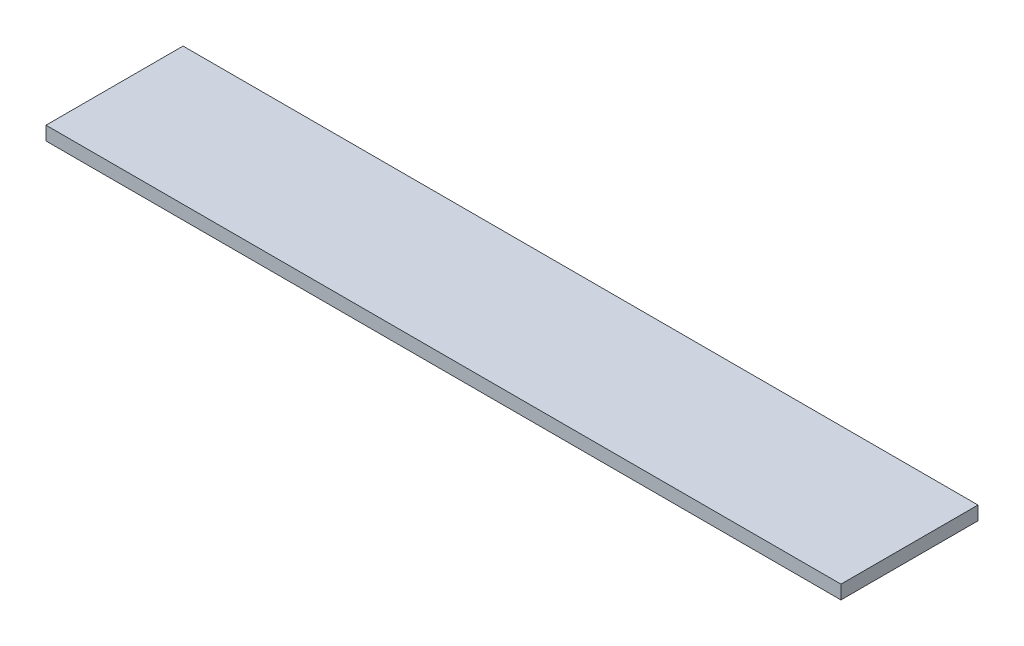
ISO-10303-21;
HEADER;
FILE_DESCRIPTION(('STEP AP214'),'2;1');
FILE_NAME('part.step','',(''),(''),'','','');
FILE_SCHEMA(('AUTOMOTIVE_DESIGN { 1 0 10303 214 1 1 1 1 }'));
ENDSEC;
DATA;
#1=APPLICATION_CONTEXT('core data for automotive mechanical design processes');
#2=APPLICATION_PROTOCOL_DEFINITION('international standard','automotive_design',2000,#1);
#3=PRODUCT_CONTEXT('',#1,'mechanical');
#4=PRODUCT('Part','Part','',(#3));
#5=PRODUCT_RELATED_PRODUCT_CATEGORY('part','',(#4));
#6=PRODUCT_DEFINITION_FORMATION('','',#4);
#7=PRODUCT_DEFINITION_CONTEXT('part definition',#1,'design');
#8=PRODUCT_DEFINITION('design','',#6,#7);
#9=PRODUCT_DEFINITION_SHAPE('','',#8);
#10=(LENGTH_UNIT() NAMED_UNIT(*) SI_UNIT(.MILLI.,.METRE.));
#11=(NAMED_UNIT(*) PLANE_ANGLE_UNIT() SI_UNIT($,.RADIAN.));
#12=(NAMED_UNIT(*) SI_UNIT($,.STERADIAN.) SOLID_ANGLE_UNIT());
#13=UNCERTAINTY_MEASURE_WITH_UNIT(LENGTH_MEASURE(1.E-05),#10,'distance_accuracy_value','');
#14=(GEOMETRIC_REPRESENTATION_CONTEXT(3) GLOBAL_UNCERTAINTY_ASSIGNED_CONTEXT((#13)) GLOBAL_UNIT_ASSIGNED_CONTEXT((#10,
#11,#12)) REPRESENTATION_CONTEXT('',''));
#15=CARTESIAN_POINT('',(0.,0.,0.));
#16=DIRECTION('',(0.,0.,1.));
#17=DIRECTION('',(1.,0.,0.));
#18=AXIS2_PLACEMENT_3D('',#15,#16,#17);
#19=CARTESIAN_POINT('',(-47.625,1.58750000000002,7.93750000000001));
#20=DIRECTION('',(0.,0.,-1.));
#21=DIRECTION('',(-1.,0.,0.));
#22=AXIS2_PLACEMENT_3D('',#19,#20,#21);
#23=PLANE('',#22);
#24=DIRECTION('',(0.,1.,0.));
#25=VECTOR('',#24,1.);
#26=CARTESIAN_POINT('',(46.0375,-0.001000000000001,7.93750000000001));
#27=LINE('',#26,#25);
#28=CARTESIAN_POINT('',(46.0375,0.,7.93750000000001));
#29=VERTEX_POINT('',#28);
#30=CARTESIAN_POINT('',(46.0375,1.58750000000002,7.93750000000001));
#31=VERTEX_POINT('',#30);
#32=EDGE_CURVE('E54',#29,#31,#27,.T.);
#33=ORIENTED_EDGE('',*,*,#32,.T.);
#34=DIRECTION('',(1.,0.,0.));
#35=VECTOR('',#34,1.);
#36=CARTESIAN_POINT('',(-47.625,1.58750000000002,7.93750000000001));
#37=LINE('',#36,#35);
#38=CARTESIAN_POINT('',(-46.0375,1.58750000000002,7.93750000000001));
#39=VERTEX_POINT('',#38);
#40=EDGE_CURVE('E46',#39,#31,#37,.T.);
#41=ORIENTED_EDGE('',*,*,#40,.F.);
#42=DIRECTION('',(0.,1.,0.));
#43=VECTOR('',#42,1.);
#44=CARTESIAN_POINT('',(-46.0375,-0.001000000000001,7.93750000000001));
#45=LINE('',#44,#43);
#46=CARTESIAN_POINT('',(-46.0375,0.,7.93750000000001));
#47=VERTEX_POINT('',#46);
#48=EDGE_CURVE('E87',#47,#39,#45,.T.);
#49=ORIENTED_EDGE('',*,*,#48,.F.);
#50=DIRECTION('',(1.,0.,0.));
#51=VECTOR('',#50,1.);
#52=CARTESIAN_POINT('',(-47.625,0.,7.93750000000001));
#53=LINE('',#52,#51);
#54=EDGE_CURVE('E93',#47,#29,#53,.T.);
#55=ORIENTED_EDGE('',*,*,#54,.T.);
#56=EDGE_LOOP('',(#33,#41,#49,#55));
#57=FACE_BOUND('',#56,.T.);
#58=ADVANCED_FACE('F38',(#57),#23,.F.);
#59=CARTESIAN_POINT('',(-47.625,1.58750000000002,-7.93750000000001));
#60=DIRECTION('',(0.,0.,1.));
#61=DIRECTION('',(1.,0.,0.));
#62=AXIS2_PLACEMENT_3D('',#59,#60,#61);
#63=PLANE('',#62);
#64=DIRECTION('',(0.,1.,0.));
#65=VECTOR('',#64,1.);
#66=CARTESIAN_POINT('',(46.0375,-0.001000000000001,-7.93750000000001));
#67=LINE('',#66,#65);
#68=CARTESIAN_POINT('',(46.0375,0.,-7.93750000000001));
#69=VERTEX_POINT('',#68);
#70=CARTESIAN_POINT('',(46.0375,1.58750000000002,-7.93750000000001));
#71=VERTEX_POINT('',#70);
#72=EDGE_CURVE('E80',#69,#71,#67,.T.);
#73=ORIENTED_EDGE('',*,*,#72,.F.);
#74=DIRECTION('',(-1.,0.,0.));
#75=VECTOR('',#74,1.);
#76=CARTESIAN_POINT('',(-47.625,0.,-7.93750000000001));
#77=LINE('',#76,#75);
#78=CARTESIAN_POINT('',(-46.0375,0.,-7.93750000000001));
#79=VERTEX_POINT('',#78);
#80=EDGE_CURVE('E41',#69,#79,#77,.T.);
#81=ORIENTED_EDGE('',*,*,#80,.T.);
#82=DIRECTION('',(0.,1.,0.));
#83=VECTOR('',#82,1.);
#84=CARTESIAN_POINT('',(-46.0375,-0.001000000000001,-7.93750000000001));
#85=LINE('',#84,#83);
#86=CARTESIAN_POINT('',(-46.0375,1.58750000000002,-7.93750000000001));
#87=VERTEX_POINT('',#86);
#88=EDGE_CURVE('E62',#79,#87,#85,.T.);
#89=ORIENTED_EDGE('',*,*,#88,.T.);
#90=DIRECTION('',(-1.,0.,0.));
#91=VECTOR('',#90,1.);
#92=CARTESIAN_POINT('',(-47.625,1.58750000000002,-7.93750000000001));
#93=LINE('',#92,#91);
#94=EDGE_CURVE('E11',#71,#87,#93,.T.);
#95=ORIENTED_EDGE('',*,*,#94,.F.);
#96=EDGE_LOOP('',(#73,#81,#89,#95));
#97=FACE_BOUND('',#96,.T.);
#98=ADVANCED_FACE('F92',(#97),#63,.F.);
#99=CARTESIAN_POINT('',(-47.625,1.58750000000002,0.));
#100=DIRECTION('',(0.,1.,0.));
#101=DIRECTION('',(0.,0.,1.));
#102=AXIS2_PLACEMENT_3D('',#99,#100,#101);
#103=PLANE('',#102);
#104=ORIENTED_EDGE('',*,*,#40,.T.);
#105=DIRECTION('',(0.,0.,-1.));
#106=VECTOR('',#105,1.);
#107=CARTESIAN_POINT('',(46.0375,1.58750000000002,-7.93750000000001));
#108=LINE('',#107,#106);
#109=EDGE_CURVE('E86',#31,#71,#108,.T.);
#110=ORIENTED_EDGE('',*,*,#109,.T.);
#111=ORIENTED_EDGE('',*,*,#94,.T.);
#112=DIRECTION('',(0.,0.,1.));
#113=VECTOR('',#112,1.);
#114=CARTESIAN_POINT('',(-46.0375,1.58750000000002,-7.93750000000001));
#115=LINE('',#114,#113);
#116=EDGE_CURVE('E104',#87,#39,#115,.T.);
#117=ORIENTED_EDGE('',*,*,#116,.T.);
#118=EDGE_LOOP('',(#104,#110,#111,#117));
#119=FACE_BOUND('',#118,.T.);
#120=ADVANCED_FACE('F110',(#119),#103,.T.);
#121=CARTESIAN_POINT('',(-47.625,0.,0.));
#122=DIRECTION('',(0.,1.,0.));
#123=DIRECTION('',(0.,0.,1.));
#124=AXIS2_PLACEMENT_3D('',#121,#122,#123);
#125=PLANE('',#124);
#126=DIRECTION('',(0.,0.,1.));
#127=VECTOR('',#126,1.);
#128=CARTESIAN_POINT('',(46.0375,0.,-7.93750000000001));
#129=LINE('',#128,#127);
#130=EDGE_CURVE('E77',#69,#29,#129,.T.);
#131=ORIENTED_EDGE('',*,*,#130,.T.);
#132=ORIENTED_EDGE('',*,*,#54,.F.);
#133=DIRECTION('',(0.,0.,-1.));
#134=VECTOR('',#133,1.);
#135=CARTESIAN_POINT('',(-46.0375,0.,-7.93750000000001));
#136=LINE('',#135,#134);
#137=EDGE_CURVE('E96',#47,#79,#136,.T.);
#138=ORIENTED_EDGE('',*,*,#137,.T.);
#139=ORIENTED_EDGE('',*,*,#80,.F.);
#140=EDGE_LOOP('',(#131,#132,#138,#139));
#141=FACE_BOUND('',#140,.T.);
#142=ADVANCED_FACE('F95',(#141),#125,.F.);
#143=CARTESIAN_POINT('',(-46.0375,-0.001000000000001,-7.93750000000001));
#144=DIRECTION('',(-1.,0.,0.));
#145=DIRECTION('',(0.,0.,1.));
#146=AXIS2_PLACEMENT_3D('',#143,#144,#145);
#147=PLANE('',#146);
#148=ORIENTED_EDGE('',*,*,#48,.T.);
#149=ORIENTED_EDGE('',*,*,#116,.F.);
#150=ORIENTED_EDGE('',*,*,#88,.F.);
#151=ORIENTED_EDGE('',*,*,#137,.F.);
#152=EDGE_LOOP('',(#148,#149,#150,#151));
#153=FACE_BOUND('',#152,.T.);
#154=ADVANCED_FACE('F112',(#153),#147,.T.);
#155=CARTESIAN_POINT('',(46.0375,-0.001000000000001,-7.93750000000001));
#156=DIRECTION('',(1.,0.,0.));
#157=DIRECTION('',(0.,0.,-1.));
#158=AXIS2_PLACEMENT_3D('',#155,#156,#157);
#159=PLANE('',#158);
#160=ORIENTED_EDGE('',*,*,#72,.T.);
#161=ORIENTED_EDGE('',*,*,#109,.F.);
#162=ORIENTED_EDGE('',*,*,#32,.F.);
#163=ORIENTED_EDGE('',*,*,#130,.F.);
#164=EDGE_LOOP('',(#160,#161,#162,#163));
#165=FACE_BOUND('',#164,.T.);
#166=ADVANCED_FACE('F79',(#165),#159,.T.);
#167=CLOSED_SHELL('',(#58,#98,#120,#142,#154,#166));
#168=MANIFOLD_SOLID_BREP('B2',#167);
#169=ADVANCED_BREP_SHAPE_REPRESENTATION('',(#18,#168),#14);
#170=SHAPE_DEFINITION_REPRESENTATION(#9,#169);
ENDSEC;
END-ISO-10303-21;
